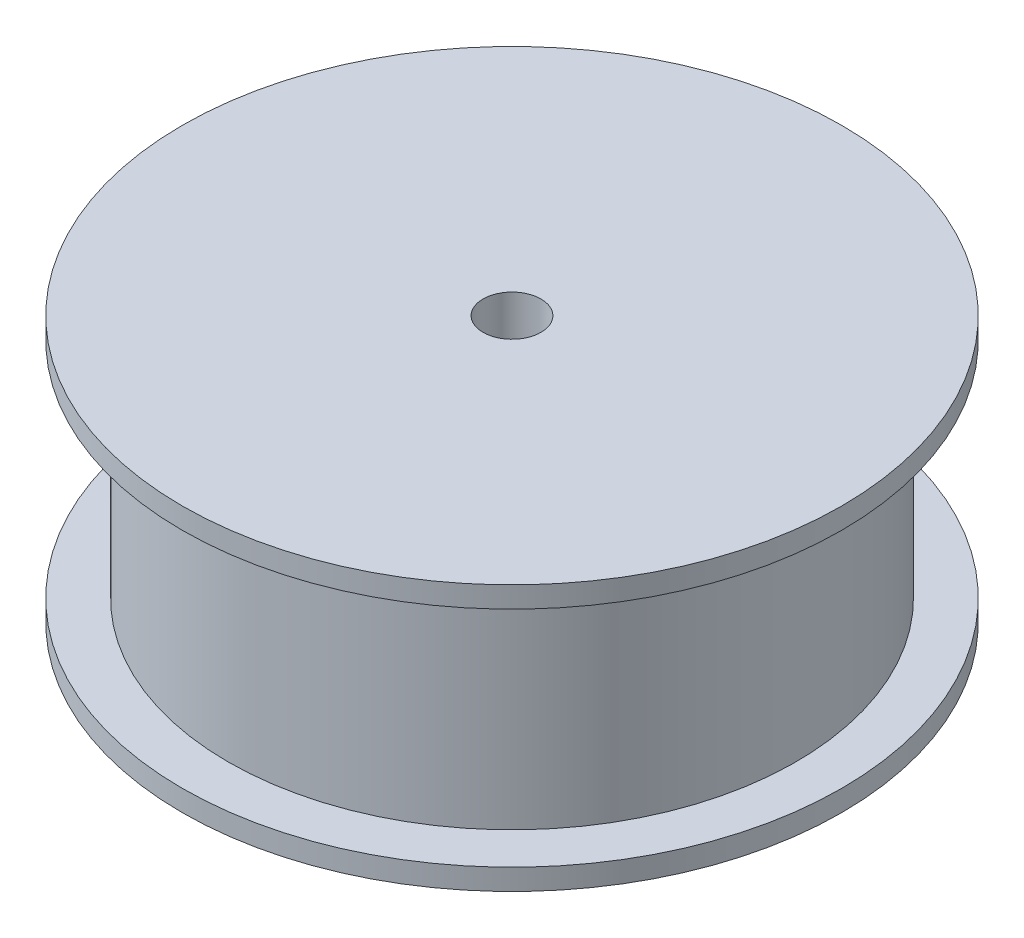
ISO-10303-21;
HEADER;
FILE_DESCRIPTION(('STEP AP214'),'2;1');
FILE_NAME('part.step','',(''),(''),'','','');
FILE_SCHEMA(('AUTOMOTIVE_DESIGN { 1 0 10303 214 1 1 1 1 }'));
ENDSEC;
DATA;
#1=APPLICATION_CONTEXT('core data for automotive mechanical design processes');
#2=APPLICATION_PROTOCOL_DEFINITION('international standard','automotive_design',2000,#1);
#3=PRODUCT_CONTEXT('',#1,'mechanical');
#4=PRODUCT('Part','Part','',(#3));
#5=PRODUCT_RELATED_PRODUCT_CATEGORY('part','',(#4));
#6=PRODUCT_DEFINITION_FORMATION('','',#4);
#7=PRODUCT_DEFINITION_CONTEXT('part definition',#1,'design');
#8=PRODUCT_DEFINITION('design','',#6,#7);
#9=PRODUCT_DEFINITION_SHAPE('','',#8);
#10=(LENGTH_UNIT() NAMED_UNIT(*) SI_UNIT(.MILLI.,.METRE.));
#11=(NAMED_UNIT(*) PLANE_ANGLE_UNIT() SI_UNIT($,.RADIAN.));
#12=(NAMED_UNIT(*) SI_UNIT($,.STERADIAN.) SOLID_ANGLE_UNIT());
#13=UNCERTAINTY_MEASURE_WITH_UNIT(LENGTH_MEASURE(1.E-05),#10,'distance_accuracy_value','');
#14=(GEOMETRIC_REPRESENTATION_CONTEXT(3) GLOBAL_UNCERTAINTY_ASSIGNED_CONTEXT((#13)) GLOBAL_UNIT_ASSIGNED_CONTEXT((#10,
#11,#12)) REPRESENTATION_CONTEXT('',''));
#15=CARTESIAN_POINT('',(0.,0.,0.));
#16=DIRECTION('',(0.,0.,1.));
#17=DIRECTION('',(1.,0.,0.));
#18=AXIS2_PLACEMENT_3D('',#15,#16,#17);
#19=CARTESIAN_POINT('',(0.,1.15,0.));
#20=DIRECTION('',(0.,-1.,0.));
#21=DIRECTION('',(0.,0.,-1.));
#22=AXIS2_PLACEMENT_3D('',#19,#20,#21);
#23=CYLINDRICAL_SURFACE('',#22,18.);
#24=CARTESIAN_POINT('',(0.,1.15,0.));
#25=DIRECTION('',(0.,1.,0.));
#26=DIRECTION('',(0.,0.,1.));
#27=AXIS2_PLACEMENT_3D('',#24,#25,#26);
#28=CIRCLE('',#27,18.);
#29=CARTESIAN_POINT('',(0.,1.15,18.));
#30=VERTEX_POINT('',#29);
#31=EDGE_CURVE('E43',#30,#30,#28,.T.);
#32=ORIENTED_EDGE('',*,*,#31,.F.);
#33=EDGE_LOOP('',(#32));
#34=FACE_BOUND('',#33,.T.);
#35=CARTESIAN_POINT('',(0.,0.,0.));
#36=DIRECTION('',(0.,1.,0.));
#37=DIRECTION('',(0.,0.,1.));
#38=AXIS2_PLACEMENT_3D('',#35,#36,#37);
#39=CIRCLE('',#38,18.);
#40=CARTESIAN_POINT('',(0.,0.,18.));
#41=VERTEX_POINT('',#40);
#42=EDGE_CURVE('E39',#41,#41,#39,.T.);
#43=ORIENTED_EDGE('',*,*,#42,.T.);
#44=EDGE_LOOP('',(#43));
#45=FACE_BOUND('',#44,.T.);
#46=ADVANCED_FACE('F36',(#34,#45),#23,.T.);
#47=CARTESIAN_POINT('',(0.,1.15,0.));
#48=DIRECTION('',(0.,1.,0.));
#49=DIRECTION('',(0.,0.,1.));
#50=AXIS2_PLACEMENT_3D('',#47,#48,#49);
#51=PLANE('',#50);
#52=CARTESIAN_POINT('',(0.,1.15,0.));
#53=DIRECTION('',(0.,1.,0.));
#54=DIRECTION('',(0.,0.,1.));
#55=AXIS2_PLACEMENT_3D('',#52,#53,#54);
#56=CIRCLE('',#55,15.499999988);
#57=CARTESIAN_POINT('',(0.,1.15,15.499999988));
#58=VERTEX_POINT('',#57);
#59=EDGE_CURVE('E10',#58,#58,#56,.T.);
#60=ORIENTED_EDGE('',*,*,#59,.F.);
#61=EDGE_LOOP('',(#60));
#62=FACE_BOUND('',#61,.T.);
#63=ORIENTED_EDGE('',*,*,#31,.T.);
#64=EDGE_LOOP('',(#63));
#65=FACE_BOUND('',#64,.T.);
#66=ADVANCED_FACE('F90',(#62,#65),#51,.T.);
#67=CARTESIAN_POINT('',(0.,0.,0.));
#68=DIRECTION('',(0.,1.,0.));
#69=DIRECTION('',(0.,0.,1.));
#70=AXIS2_PLACEMENT_3D('',#67,#68,#69);
#71=PLANE('',#70);
#72=CARTESIAN_POINT('',(0.,0.,0.));
#73=DIRECTION('',(0.,1.,0.));
#74=DIRECTION('',(0.,0.,1.));
#75=AXIS2_PLACEMENT_3D('',#72,#73,#74);
#76=CIRCLE('',#75,1.58);
#77=CARTESIAN_POINT('',(0.,0.,1.58));
#78=VERTEX_POINT('',#77);
#79=EDGE_CURVE('E56',#78,#78,#76,.F.);
#80=ORIENTED_EDGE('',*,*,#79,.F.);
#81=EDGE_LOOP('',(#80));
#82=FACE_BOUND('',#81,.T.);
#83=ORIENTED_EDGE('',*,*,#42,.F.);
#84=EDGE_LOOP('',(#83));
#85=FACE_BOUND('',#84,.T.);
#86=ADVANCED_FACE('F95',(#82,#85),#71,.F.);
#87=CARTESIAN_POINT('',(0.,13.35,0.));
#88=DIRECTION('',(0.,-1.,0.));
#89=DIRECTION('',(0.,0.,-1.));
#90=AXIS2_PLACEMENT_3D('',#87,#88,#89);
#91=CYLINDRICAL_SURFACE('',#90,15.499999988);
#92=CARTESIAN_POINT('',(0.,13.35,0.));
#93=DIRECTION('',(0.,1.,0.));
#94=DIRECTION('',(0.,0.,1.));
#95=AXIS2_PLACEMENT_3D('',#92,#93,#94);
#96=CIRCLE('',#95,15.499999988);
#97=CARTESIAN_POINT('',(0.,13.35,15.499999988));
#98=VERTEX_POINT('',#97);
#99=EDGE_CURVE('E49',#98,#98,#96,.T.);
#100=ORIENTED_EDGE('',*,*,#99,.F.);
#101=EDGE_LOOP('',(#100));
#102=FACE_BOUND('',#101,.T.);
#103=ORIENTED_EDGE('',*,*,#59,.T.);
#104=EDGE_LOOP('',(#103));
#105=FACE_BOUND('',#104,.T.);
#106=ADVANCED_FACE('F77',(#102,#105),#91,.T.);
#107=CARTESIAN_POINT('',(0.,14.5,0.));
#108=DIRECTION('',(0.,-1.,0.));
#109=DIRECTION('',(0.,0.,-1.));
#110=AXIS2_PLACEMENT_3D('',#107,#108,#109);
#111=CYLINDRICAL_SURFACE('',#110,18.);
#112=CARTESIAN_POINT('',(0.,14.5,0.));
#113=DIRECTION('',(0.,1.,0.));
#114=DIRECTION('',(0.,0.,1.));
#115=AXIS2_PLACEMENT_3D('',#112,#113,#114);
#116=CIRCLE('',#115,18.);
#117=CARTESIAN_POINT('',(0.,14.5,18.));
#118=VERTEX_POINT('',#117);
#119=EDGE_CURVE('E52',#118,#118,#116,.T.);
#120=ORIENTED_EDGE('',*,*,#119,.F.);
#121=EDGE_LOOP('',(#120));
#122=FACE_BOUND('',#121,.T.);
#123=CARTESIAN_POINT('',(0.,13.35,0.));
#124=DIRECTION('',(0.,1.,0.));
#125=DIRECTION('',(0.,0.,1.));
#126=AXIS2_PLACEMENT_3D('',#123,#124,#125);
#127=CIRCLE('',#126,18.);
#128=CARTESIAN_POINT('',(0.,13.35,18.));
#129=VERTEX_POINT('',#128);
#130=EDGE_CURVE('E53',#129,#129,#127,.T.);
#131=ORIENTED_EDGE('',*,*,#130,.T.);
#132=EDGE_LOOP('',(#131));
#133=FACE_BOUND('',#132,.T.);
#134=ADVANCED_FACE('F71',(#122,#133),#111,.T.);
#135=CARTESIAN_POINT('',(0.,14.5,0.));
#136=DIRECTION('',(0.,1.,0.));
#137=DIRECTION('',(0.,0.,1.));
#138=AXIS2_PLACEMENT_3D('',#135,#136,#137);
#139=PLANE('',#138);
#140=CARTESIAN_POINT('',(0.,14.5,0.));
#141=DIRECTION('',(0.,1.,0.));
#142=DIRECTION('',(0.,0.,1.));
#143=AXIS2_PLACEMENT_3D('',#140,#141,#142);
#144=CIRCLE('',#143,1.58);
#145=CARTESIAN_POINT('',(0.,14.5,1.58));
#146=VERTEX_POINT('',#145);
#147=EDGE_CURVE('E61',#146,#146,#144,.T.);
#148=ORIENTED_EDGE('',*,*,#147,.F.);
#149=EDGE_LOOP('',(#148));
#150=FACE_BOUND('',#149,.T.);
#151=ORIENTED_EDGE('',*,*,#119,.T.);
#152=EDGE_LOOP('',(#151));
#153=FACE_BOUND('',#152,.T.);
#154=ADVANCED_FACE('F67',(#150,#153),#139,.T.);
#155=CARTESIAN_POINT('',(0.,13.35,0.));
#156=DIRECTION('',(0.,1.,0.));
#157=DIRECTION('',(0.,0.,1.));
#158=AXIS2_PLACEMENT_3D('',#155,#156,#157);
#159=PLANE('',#158);
#160=ORIENTED_EDGE('',*,*,#99,.T.);
#161=EDGE_LOOP('',(#160));
#162=FACE_BOUND('',#161,.T.);
#163=ORIENTED_EDGE('',*,*,#130,.F.);
#164=EDGE_LOOP('',(#163));
#165=FACE_BOUND('',#164,.T.);
#166=ADVANCED_FACE('F70',(#162,#165),#159,.F.);
#167=CARTESIAN_POINT('',(0.,-4.46891485709897,0.));
#168=DIRECTION('',(0.,1.,0.));
#169=DIRECTION('',(0.,0.,1.));
#170=AXIS2_PLACEMENT_3D('',#167,#168,#169);
#171=CYLINDRICAL_SURFACE('',#170,1.58);
#172=ORIENTED_EDGE('',*,*,#79,.T.);
#173=EDGE_LOOP('',(#172));
#174=FACE_BOUND('',#173,.T.);
#175=ORIENTED_EDGE('',*,*,#147,.T.);
#176=EDGE_LOOP('',(#175));
#177=FACE_BOUND('',#176,.T.);
#178=ADVANCED_FACE('F65',(#174,#177),#171,.F.);
#179=CLOSED_SHELL('',(#46,#66,#86,#106,#134,#154,#166,#178));
#180=MANIFOLD_SOLID_BREP('B2',#179);
#181=ADVANCED_BREP_SHAPE_REPRESENTATION('',(#18,#180),#14);
#182=SHAPE_DEFINITION_REPRESENTATION(#9,#181);
ENDSEC;
END-ISO-10303-21;
